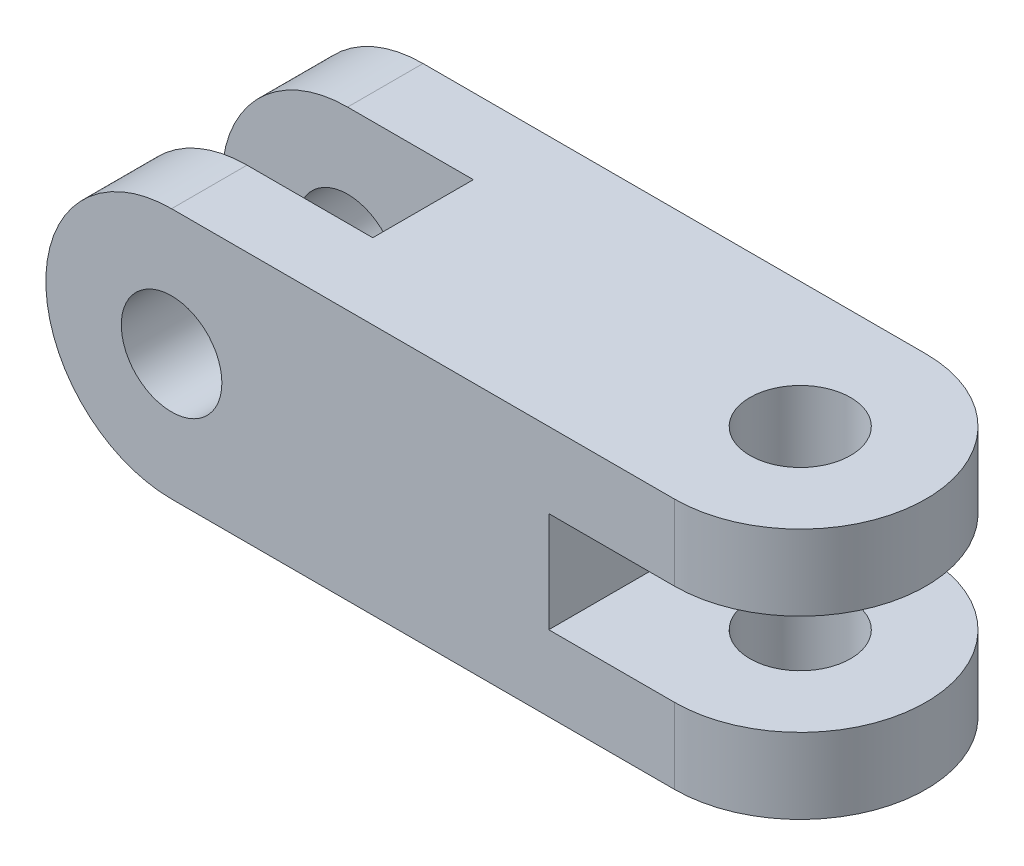
ISO-10303-21;
HEADER;
FILE_DESCRIPTION(('STEP AP214'),'2;1');
FILE_NAME('part.step','',(''),(''),'','','');
FILE_SCHEMA(('AUTOMOTIVE_DESIGN { 1 0 10303 214 1 1 1 1 }'));
ENDSEC;
DATA;
#1=APPLICATION_CONTEXT('core data for automotive mechanical design processes');
#2=APPLICATION_PROTOCOL_DEFINITION('international standard','automotive_design',2000,#1);
#3=PRODUCT_CONTEXT('',#1,'mechanical');
#4=PRODUCT('Part','Part','',(#3));
#5=PRODUCT_RELATED_PRODUCT_CATEGORY('part','',(#4));
#6=PRODUCT_DEFINITION_FORMATION('','',#4);
#7=PRODUCT_DEFINITION_CONTEXT('part definition',#1,'design');
#8=PRODUCT_DEFINITION('design','',#6,#7);
#9=PRODUCT_DEFINITION_SHAPE('','',#8);
#10=(LENGTH_UNIT() NAMED_UNIT(*) SI_UNIT(.MILLI.,.METRE.));
#11=(NAMED_UNIT(*) PLANE_ANGLE_UNIT() SI_UNIT($,.RADIAN.));
#12=(NAMED_UNIT(*) SI_UNIT($,.STERADIAN.) SOLID_ANGLE_UNIT());
#13=UNCERTAINTY_MEASURE_WITH_UNIT(LENGTH_MEASURE(1.E-05),#10,'distance_accuracy_value','');
#14=(GEOMETRIC_REPRESENTATION_CONTEXT(3) GLOBAL_UNCERTAINTY_ASSIGNED_CONTEXT((#13)) GLOBAL_UNIT_ASSIGNED_CONTEXT((#10,
#11,#12)) REPRESENTATION_CONTEXT('',''));
#15=CARTESIAN_POINT('',(0.,0.,0.));
#16=DIRECTION('',(0.,0.,1.));
#17=DIRECTION('',(1.,0.,0.));
#18=AXIS2_PLACEMENT_3D('',#15,#16,#17);
#19=CARTESIAN_POINT('',(-62.5,0.,-50.));
#20=DIRECTION('',(0.,0.,1.));
#21=DIRECTION('',(1.,0.,0.));
#22=AXIS2_PLACEMENT_3D('',#19,#20,#21);
#23=CYLINDRICAL_SURFACE('',#22,25.);
#24=CARTESIAN_POINT('',(-62.5,0.,-35.));
#25=DIRECTION('',(0.,0.,-1.));
#26=DIRECTION('',(-1.,0.,0.));
#27=AXIS2_PLACEMENT_3D('',#24,#25,#26);
#28=CIRCLE('',#27,25.);
#29=CARTESIAN_POINT('',(-62.5,25.,-35.));
#30=VERTEX_POINT('',#29);
#31=CARTESIAN_POINT('',(-62.5,-25.0000000000001,-35.));
#32=VERTEX_POINT('',#31);
#33=EDGE_CURVE('E175',#30,#32,#28,.F.);
#34=ORIENTED_EDGE('',*,*,#33,.F.);
#35=DIRECTION('',(0.,0.,1.));
#36=VECTOR('',#35,1.);
#37=CARTESIAN_POINT('',(-62.5,25.,-50.));
#38=LINE('',#37,#36);
#39=CARTESIAN_POINT('',(-62.5,25.,-50.));
#40=VERTEX_POINT('',#39);
#41=EDGE_CURVE('E268',#40,#30,#38,.T.);
#42=ORIENTED_EDGE('',*,*,#41,.F.);
#43=CARTESIAN_POINT('',(-62.5,0.,-50.));
#44=DIRECTION('',(0.,0.,1.));
#45=DIRECTION('',(1.,0.,0.));
#46=AXIS2_PLACEMENT_3D('',#43,#44,#45);
#47=CIRCLE('',#46,25.);
#48=CARTESIAN_POINT('',(-62.5,-25.,-50.));
#49=VERTEX_POINT('',#48);
#50=EDGE_CURVE('E232',#40,#49,#47,.T.);
#51=ORIENTED_EDGE('',*,*,#50,.T.);
#52=DIRECTION('',(0.,0.,1.));
#53=VECTOR('',#52,1.);
#54=CARTESIAN_POINT('',(-62.5,-25.,-50.));
#55=LINE('',#54,#53);
#56=EDGE_CURVE('E262',#49,#32,#55,.T.);
#57=ORIENTED_EDGE('',*,*,#56,.T.);
#58=EDGE_LOOP('',(#34,#42,#51,#57));
#59=FACE_BOUND('',#58,.T.);
#60=ADVANCED_FACE('F42',(#59),#23,.T.);
#61=CARTESIAN_POINT('',(-62.5,0.,-50.));
#62=DIRECTION('',(0.,0.,1.));
#63=DIRECTION('',(1.,0.,0.));
#64=AXIS2_PLACEMENT_3D('',#61,#62,#63);
#65=CYLINDRICAL_SURFACE('',#64,10.);
#66=CARTESIAN_POINT('',(-62.5,0.,-35.));
#67=DIRECTION('',(0.,0.,-1.));
#68=DIRECTION('',(-1.,0.,0.));
#69=AXIS2_PLACEMENT_3D('',#66,#67,#68);
#70=CIRCLE('',#69,10.);
#71=CARTESIAN_POINT('',(-72.5,0.,-35.));
#72=VERTEX_POINT('',#71);
#73=EDGE_CURVE('E46',#72,#72,#70,.F.);
#74=ORIENTED_EDGE('',*,*,#73,.T.);
#75=EDGE_LOOP('',(#74));
#76=FACE_BOUND('',#75,.T.);
#77=CARTESIAN_POINT('',(-62.5,0.,-50.));
#78=DIRECTION('',(0.,0.,1.));
#79=DIRECTION('',(1.,0.,0.));
#80=AXIS2_PLACEMENT_3D('',#77,#78,#79);
#81=CIRCLE('',#80,10.);
#82=CARTESIAN_POINT('',(-52.5,0.,-50.));
#83=VERTEX_POINT('',#82);
#84=EDGE_CURVE('E209',#83,#83,#81,.T.);
#85=ORIENTED_EDGE('',*,*,#84,.F.);
#86=EDGE_LOOP('',(#85));
#87=FACE_BOUND('',#86,.T.);
#88=ADVANCED_FACE('F303',(#76,#87),#65,.F.);
#89=CARTESIAN_POINT('',(-62.5,-25.,-50.));
#90=DIRECTION('',(0.,-1.,0.));
#91=DIRECTION('',(1.,0.,0.));
#92=AXIS2_PLACEMENT_3D('',#89,#90,#91);
#93=PLANE('',#92);
#94=DIRECTION('',(1.,0.,0.));
#95=VECTOR('',#94,1.);
#96=CARTESIAN_POINT('',(-62.5,-25.,-35.));
#97=LINE('',#96,#95);
#98=CARTESIAN_POINT('',(-37.5,-25.,-35.));
#99=VERTEX_POINT('',#98);
#100=EDGE_CURVE('E178',#32,#99,#97,.T.);
#101=ORIENTED_EDGE('',*,*,#100,.F.);
#102=ORIENTED_EDGE('',*,*,#56,.F.);
#103=DIRECTION('',(1.,0.,0.));
#104=VECTOR('',#103,1.);
#105=CARTESIAN_POINT('',(-62.5,-25.,-50.));
#106=LINE('',#105,#104);
#107=CARTESIAN_POINT('',(37.5,-25.,-50.));
#108=VERTEX_POINT('',#107);
#109=EDGE_CURVE('E236',#49,#108,#106,.T.);
#110=ORIENTED_EDGE('',*,*,#109,.T.);
#111=CARTESIAN_POINT('',(37.5,-25.,-25.));
#112=DIRECTION('',(0.,-1.,0.));
#113=DIRECTION('',(1.,0.,0.));
#114=AXIS2_PLACEMENT_3D('',#111,#112,#113);
#115=CIRCLE('',#114,25.);
#116=CARTESIAN_POINT('',(37.5,-25.,0.));
#117=VERTEX_POINT('',#116);
#118=EDGE_CURVE('E67',#108,#117,#115,.T.);
#119=ORIENTED_EDGE('',*,*,#118,.T.);
#120=DIRECTION('',(1.,0.,0.));
#121=VECTOR('',#120,1.);
#122=CARTESIAN_POINT('',(-62.5,-25.,0.));
#123=LINE('',#122,#121);
#124=CARTESIAN_POINT('',(-62.5,-25.,0.));
#125=VERTEX_POINT('',#124);
#126=EDGE_CURVE('E221',#125,#117,#123,.T.);
#127=ORIENTED_EDGE('',*,*,#126,.F.);
#128=CARTESIAN_POINT('',(-62.5,-25.0000000000001,-15.));
#129=VERTEX_POINT('',#128);
#130=EDGE_CURVE('E267',#129,#125,#55,.T.);
#131=ORIENTED_EDGE('',*,*,#130,.F.);
#132=DIRECTION('',(-1.,0.,0.));
#133=VECTOR('',#132,1.);
#134=CARTESIAN_POINT('',(-62.5,-25.,-15.));
#135=LINE('',#134,#133);
#136=CARTESIAN_POINT('',(-37.5,-25.,-15.));
#137=VERTEX_POINT('',#136);
#138=EDGE_CURVE('E172',#137,#129,#135,.T.);
#139=ORIENTED_EDGE('',*,*,#138,.F.);
#140=DIRECTION('',(0.,0.,1.));
#141=VECTOR('',#140,1.);
#142=CARTESIAN_POINT('',(-37.5,-25.,-50.));
#143=LINE('',#142,#141);
#144=EDGE_CURVE('E141',#99,#137,#143,.T.);
#145=ORIENTED_EDGE('',*,*,#144,.F.);
#146=EDGE_LOOP('',(#101,#102,#110,#119,#127,#131,#139,#145));
#147=FACE_BOUND('',#146,.T.);
#148=CARTESIAN_POINT('',(37.5,-25.,-25.));
#149=DIRECTION('',(0.,-1.,0.));
#150=DIRECTION('',(1.,0.,0.));
#151=AXIS2_PLACEMENT_3D('',#148,#149,#150);
#152=CIRCLE('',#151,10.);
#153=CARTESIAN_POINT('',(47.5,-25.,-25.));
#154=VERTEX_POINT('',#153);
#155=EDGE_CURVE('E192',#154,#154,#152,.T.);
#156=ORIENTED_EDGE('',*,*,#155,.F.);
#157=EDGE_LOOP('',(#156));
#158=FACE_BOUND('',#157,.T.);
#159=ADVANCED_FACE('F310',(#147,#158),#93,.T.);
#160=CARTESIAN_POINT('',(-62.5,25.,-50.));
#161=DIRECTION('',(0.,1.,0.));
#162=DIRECTION('',(-1.,0.,0.));
#163=AXIS2_PLACEMENT_3D('',#160,#161,#162);
#164=PLANE('',#163);
#165=DIRECTION('',(-1.,0.,0.));
#166=VECTOR('',#165,1.);
#167=CARTESIAN_POINT('',(-37.5,25.,-35.));
#168=LINE('',#167,#166);
#169=CARTESIAN_POINT('',(-37.5,25.,-35.));
#170=VERTEX_POINT('',#169);
#171=EDGE_CURVE('E146',#170,#30,#168,.T.);
#172=ORIENTED_EDGE('',*,*,#171,.F.);
#173=DIRECTION('',(0.,0.,-1.));
#174=VECTOR('',#173,1.);
#175=CARTESIAN_POINT('',(-37.5,25.,-15.));
#176=LINE('',#175,#174);
#177=CARTESIAN_POINT('',(-37.5,25.,-15.));
#178=VERTEX_POINT('',#177);
#179=EDGE_CURVE('E138',#178,#170,#176,.T.);
#180=ORIENTED_EDGE('',*,*,#179,.F.);
#181=DIRECTION('',(1.,0.,0.));
#182=VECTOR('',#181,1.);
#183=CARTESIAN_POINT('',(-37.5,25.,-15.));
#184=LINE('',#183,#182);
#185=CARTESIAN_POINT('',(-62.5,25.,-15.));
#186=VERTEX_POINT('',#185);
#187=EDGE_CURVE('E149',#186,#178,#184,.T.);
#188=ORIENTED_EDGE('',*,*,#187,.F.);
#189=CARTESIAN_POINT('',(-62.5,25.,0.));
#190=VERTEX_POINT('',#189);
#191=EDGE_CURVE('E271',#186,#190,#38,.T.);
#192=ORIENTED_EDGE('',*,*,#191,.T.);
#193=DIRECTION('',(-1.,0.,0.));
#194=VECTOR('',#193,1.);
#195=CARTESIAN_POINT('',(-62.5,25.,0.));
#196=LINE('',#195,#194);
#197=CARTESIAN_POINT('',(37.5,25.,0.));
#198=VERTEX_POINT('',#197);
#199=EDGE_CURVE('E251',#198,#190,#196,.T.);
#200=ORIENTED_EDGE('',*,*,#199,.F.);
#201=CARTESIAN_POINT('',(37.5,25.,-25.));
#202=DIRECTION('',(0.,1.,0.));
#203=DIRECTION('',(-1.,0.,0.));
#204=AXIS2_PLACEMENT_3D('',#201,#202,#203);
#205=CIRCLE('',#204,25.);
#206=CARTESIAN_POINT('',(37.5,25.,-50.));
#207=VERTEX_POINT('',#206);
#208=EDGE_CURVE('E196',#198,#207,#205,.T.);
#209=ORIENTED_EDGE('',*,*,#208,.T.);
#210=DIRECTION('',(-1.,0.,0.));
#211=VECTOR('',#210,1.);
#212=CARTESIAN_POINT('',(-62.5,25.,-50.));
#213=LINE('',#212,#211);
#214=EDGE_CURVE('E229',#207,#40,#213,.T.);
#215=ORIENTED_EDGE('',*,*,#214,.T.);
#216=ORIENTED_EDGE('',*,*,#41,.T.);
#217=EDGE_LOOP('',(#172,#180,#188,#192,#200,#209,#215,#216));
#218=FACE_BOUND('',#217,.T.);
#219=CARTESIAN_POINT('',(37.5,25.,-25.));
#220=DIRECTION('',(0.,1.,0.));
#221=DIRECTION('',(-1.,0.,0.));
#222=AXIS2_PLACEMENT_3D('',#219,#220,#221);
#223=CIRCLE('',#222,10.);
#224=CARTESIAN_POINT('',(27.5,25.,-25.));
#225=VERTEX_POINT('',#224);
#226=EDGE_CURVE('E183',#225,#225,#223,.T.);
#227=ORIENTED_EDGE('',*,*,#226,.F.);
#228=EDGE_LOOP('',(#227));
#229=FACE_BOUND('',#228,.T.);
#230=ADVANCED_FACE('F158',(#218,#229),#164,.T.);
#231=CARTESIAN_POINT('',(12.5,9.99999999999998,-50.));
#232=DIRECTION('',(0.,-1.,0.));
#233=DIRECTION('',(0.,0.,-1.));
#234=AXIS2_PLACEMENT_3D('',#231,#232,#233);
#235=PLANE('',#234);
#236=CARTESIAN_POINT('',(37.5,9.99999999999998,-25.));
#237=DIRECTION('',(0.,-1.,0.));
#238=DIRECTION('',(0.,0.,-1.));
#239=AXIS2_PLACEMENT_3D('',#236,#237,#238);
#240=CIRCLE('',#239,10.);
#241=CARTESIAN_POINT('',(37.5,9.99999999999998,-35.));
#242=VERTEX_POINT('',#241);
#243=EDGE_CURVE('E188',#242,#242,#240,.T.);
#244=ORIENTED_EDGE('',*,*,#243,.F.);
#245=EDGE_LOOP('',(#244));
#246=FACE_BOUND('',#245,.T.);
#247=CARTESIAN_POINT('',(37.5,9.99999999999998,-25.));
#248=DIRECTION('',(0.,-1.,0.));
#249=DIRECTION('',(0.,0.,-1.));
#250=AXIS2_PLACEMENT_3D('',#247,#248,#249);
#251=CIRCLE('',#250,25.);
#252=CARTESIAN_POINT('',(37.5,9.99999999999998,-50.));
#253=VERTEX_POINT('',#252);
#254=CARTESIAN_POINT('',(37.5,9.99999999999998,0.));
#255=VERTEX_POINT('',#254);
#256=EDGE_CURVE('E59',#253,#255,#251,.T.);
#257=ORIENTED_EDGE('',*,*,#256,.T.);
#258=DIRECTION('',(1.,0.,0.));
#259=VECTOR('',#258,1.);
#260=CARTESIAN_POINT('',(12.5,9.99999999999998,0.));
#261=LINE('',#260,#259);
#262=CARTESIAN_POINT('',(12.5,9.99999999999998,0.));
#263=VERTEX_POINT('',#262);
#264=EDGE_CURVE('E247',#263,#255,#261,.T.);
#265=ORIENTED_EDGE('',*,*,#264,.F.);
#266=DIRECTION('',(0.,0.,1.));
#267=VECTOR('',#266,1.);
#268=CARTESIAN_POINT('',(12.5,9.99999999999998,-50.));
#269=LINE('',#268,#267);
#270=CARTESIAN_POINT('',(12.5,9.99999999999998,-50.));
#271=VERTEX_POINT('',#270);
#272=EDGE_CURVE('E272',#271,#263,#269,.T.);
#273=ORIENTED_EDGE('',*,*,#272,.F.);
#274=DIRECTION('',(1.,0.,0.));
#275=VECTOR('',#274,1.);
#276=CARTESIAN_POINT('',(12.5,9.99999999999998,-50.));
#277=LINE('',#276,#275);
#278=EDGE_CURVE('E225',#271,#253,#277,.T.);
#279=ORIENTED_EDGE('',*,*,#278,.T.);
#280=EDGE_LOOP('',(#257,#265,#273,#279));
#281=FACE_BOUND('',#280,.T.);
#282=ADVANCED_FACE('F358',(#246,#281),#235,.T.);
#283=CARTESIAN_POINT('',(12.5,-10.,-50.));
#284=DIRECTION('',(0.,1.,0.));
#285=DIRECTION('',(0.,0.,1.));
#286=AXIS2_PLACEMENT_3D('',#283,#284,#285);
#287=PLANE('',#286);
#288=CARTESIAN_POINT('',(37.5,-10.,-25.));
#289=DIRECTION('',(0.,1.,0.));
#290=DIRECTION('',(0.,0.,1.));
#291=AXIS2_PLACEMENT_3D('',#288,#289,#290);
#292=CIRCLE('',#291,10.);
#293=CARTESIAN_POINT('',(37.5,-10.,-15.));
#294=VERTEX_POINT('',#293);
#295=EDGE_CURVE('E187',#294,#294,#292,.T.);
#296=ORIENTED_EDGE('',*,*,#295,.F.);
#297=EDGE_LOOP('',(#296));
#298=FACE_BOUND('',#297,.T.);
#299=DIRECTION('',(-1.,0.,0.));
#300=VECTOR('',#299,1.);
#301=CARTESIAN_POINT('',(12.5,-10.,0.));
#302=LINE('',#301,#300);
#303=CARTESIAN_POINT('',(37.5,-10.,0.));
#304=VERTEX_POINT('',#303);
#305=CARTESIAN_POINT('',(12.5,-10.,0.));
#306=VERTEX_POINT('',#305);
#307=EDGE_CURVE('E213',#304,#306,#302,.T.);
#308=ORIENTED_EDGE('',*,*,#307,.F.);
#309=CARTESIAN_POINT('',(37.5,-10.,-25.));
#310=DIRECTION('',(0.,1.,0.));
#311=DIRECTION('',(0.,0.,1.));
#312=AXIS2_PLACEMENT_3D('',#309,#310,#311);
#313=CIRCLE('',#312,25.);
#314=CARTESIAN_POINT('',(37.5,-10.,-50.));
#315=VERTEX_POINT('',#314);
#316=EDGE_CURVE('E200',#304,#315,#313,.T.);
#317=ORIENTED_EDGE('',*,*,#316,.T.);
#318=DIRECTION('',(-1.,0.,0.));
#319=VECTOR('',#318,1.);
#320=CARTESIAN_POINT('',(12.5,-10.,-50.));
#321=LINE('',#320,#319);
#322=CARTESIAN_POINT('',(12.5,-10.,-50.));
#323=VERTEX_POINT('',#322);
#324=EDGE_CURVE('E217',#315,#323,#321,.T.);
#325=ORIENTED_EDGE('',*,*,#324,.T.);
#326=DIRECTION('',(0.,0.,1.));
#327=VECTOR('',#326,1.);
#328=CARTESIAN_POINT('',(12.5,-10.,-50.));
#329=LINE('',#328,#327);
#330=EDGE_CURVE('E240',#323,#306,#329,.T.);
#331=ORIENTED_EDGE('',*,*,#330,.T.);
#332=EDGE_LOOP('',(#308,#317,#325,#331));
#333=FACE_BOUND('',#332,.T.);
#334=ADVANCED_FACE('F44',(#298,#333),#287,.T.);
#335=CARTESIAN_POINT('',(-62.5,0.,-50.));
#336=DIRECTION('',(0.,0.,1.));
#337=DIRECTION('',(1.,0.,0.));
#338=AXIS2_PLACEMENT_3D('',#335,#336,#337);
#339=PLANE('',#338);
#340=ORIENTED_EDGE('',*,*,#84,.T.);
#341=EDGE_LOOP('',(#340));
#342=FACE_BOUND('',#341,.T.);
#343=DIRECTION('',(0.,1.,0.));
#344=VECTOR('',#343,1.);
#345=CARTESIAN_POINT('',(37.5,-61.,-50.));
#346=LINE('',#345,#344);
#347=EDGE_CURVE('E279',#108,#315,#346,.T.);
#348=ORIENTED_EDGE('',*,*,#347,.F.);
#349=ORIENTED_EDGE('',*,*,#109,.F.);
#350=ORIENTED_EDGE('',*,*,#50,.F.);
#351=ORIENTED_EDGE('',*,*,#214,.F.);
#352=EDGE_CURVE('E266',#253,#207,#346,.T.);
#353=ORIENTED_EDGE('',*,*,#352,.F.);
#354=ORIENTED_EDGE('',*,*,#278,.F.);
#355=DIRECTION('',(0.,1.,0.));
#356=VECTOR('',#355,1.);
#357=CARTESIAN_POINT('',(12.5,9.99999999999998,-50.));
#358=LINE('',#357,#356);
#359=EDGE_CURVE('E220',#323,#271,#358,.T.);
#360=ORIENTED_EDGE('',*,*,#359,.F.);
#361=ORIENTED_EDGE('',*,*,#324,.F.);
#362=EDGE_LOOP('',(#348,#349,#350,#351,#353,#354,#360,#361));
#363=FACE_BOUND('',#362,.T.);
#364=ADVANCED_FACE('F317',(#342,#363),#339,.F.);
#365=CARTESIAN_POINT('',(-62.5,0.,-15.));
#366=DIRECTION('',(0.,0.,1.));
#367=DIRECTION('',(1.,0.,0.));
#368=AXIS2_PLACEMENT_3D('',#365,#366,#367);
#369=CIRCLE('',#368,25.);
#370=EDGE_CURVE('E153',#129,#186,#369,.F.);
#371=ORIENTED_EDGE('',*,*,#370,.F.);
#372=ORIENTED_EDGE('',*,*,#130,.T.);
#373=CARTESIAN_POINT('',(-62.5,0.,0.));
#374=DIRECTION('',(0.,0.,1.));
#375=DIRECTION('',(1.,0.,0.));
#376=AXIS2_PLACEMENT_3D('',#373,#374,#375);
#377=CIRCLE('',#376,25.);
#378=EDGE_CURVE('E255',#190,#125,#377,.T.);
#379=ORIENTED_EDGE('',*,*,#378,.F.);
#380=ORIENTED_EDGE('',*,*,#191,.F.);
#381=EDGE_LOOP('',(#371,#372,#379,#380));
#382=FACE_BOUND('',#381,.T.);
#383=ADVANCED_FACE('F306',(#382),#23,.T.);
#384=CARTESIAN_POINT('',(12.5,9.99999999999998,-50.));
#385=DIRECTION('',(1.,0.,0.));
#386=DIRECTION('',(0.,1.,0.));
#387=AXIS2_PLACEMENT_3D('',#384,#385,#386);
#388=PLANE('',#387);
#389=DIRECTION('',(0.,1.,0.));
#390=VECTOR('',#389,1.);
#391=CARTESIAN_POINT('',(12.5,9.99999999999998,0.));
#392=LINE('',#391,#390);
#393=EDGE_CURVE('E243',#306,#263,#392,.T.);
#394=ORIENTED_EDGE('',*,*,#393,.F.);
#395=ORIENTED_EDGE('',*,*,#330,.F.);
#396=ORIENTED_EDGE('',*,*,#359,.T.);
#397=ORIENTED_EDGE('',*,*,#272,.T.);
#398=EDGE_LOOP('',(#394,#395,#396,#397));
#399=FACE_BOUND('',#398,.T.);
#400=ADVANCED_FACE('F316',(#399),#388,.T.);
#401=CARTESIAN_POINT('',(-62.5,0.,0.));
#402=DIRECTION('',(0.,0.,1.));
#403=DIRECTION('',(1.,0.,0.));
#404=AXIS2_PLACEMENT_3D('',#401,#402,#403);
#405=PLANE('',#404);
#406=DIRECTION('',(0.,1.,0.));
#407=VECTOR('',#406,1.);
#408=CARTESIAN_POINT('',(37.5,-61.,0.));
#409=LINE('',#408,#407);
#410=EDGE_CURVE('E11',#198,#255,#409,.F.);
#411=ORIENTED_EDGE('',*,*,#410,.F.);
#412=ORIENTED_EDGE('',*,*,#199,.T.);
#413=ORIENTED_EDGE('',*,*,#378,.T.);
#414=ORIENTED_EDGE('',*,*,#126,.T.);
#415=EDGE_CURVE('E52',#304,#117,#409,.F.);
#416=ORIENTED_EDGE('',*,*,#415,.F.);
#417=ORIENTED_EDGE('',*,*,#307,.T.);
#418=ORIENTED_EDGE('',*,*,#393,.T.);
#419=ORIENTED_EDGE('',*,*,#264,.T.);
#420=EDGE_LOOP('',(#411,#412,#413,#414,#416,#417,#418,#419));
#421=FACE_BOUND('',#420,.T.);
#422=CARTESIAN_POINT('',(-62.5,0.,0.));
#423=DIRECTION('',(0.,0.,1.));
#424=DIRECTION('',(1.,0.,0.));
#425=AXIS2_PLACEMENT_3D('',#422,#423,#424);
#426=CIRCLE('',#425,10.);
#427=CARTESIAN_POINT('',(-52.5,0.,0.));
#428=VERTEX_POINT('',#427);
#429=EDGE_CURVE('E208',#428,#428,#426,.T.);
#430=ORIENTED_EDGE('',*,*,#429,.F.);
#431=EDGE_LOOP('',(#430));
#432=FACE_BOUND('',#431,.T.);
#433=ADVANCED_FACE('F323',(#421,#432),#405,.T.);
#434=CARTESIAN_POINT('',(-62.5,0.,-15.));
#435=DIRECTION('',(0.,0.,1.));
#436=DIRECTION('',(1.,0.,0.));
#437=AXIS2_PLACEMENT_3D('',#434,#435,#436);
#438=CIRCLE('',#437,10.);
#439=CARTESIAN_POINT('',(-52.5,0.,-15.));
#440=VERTEX_POINT('',#439);
#441=EDGE_CURVE('E168',#440,#440,#438,.F.);
#442=ORIENTED_EDGE('',*,*,#441,.T.);
#443=EDGE_LOOP('',(#442));
#444=FACE_BOUND('',#443,.T.);
#445=ORIENTED_EDGE('',*,*,#429,.T.);
#446=EDGE_LOOP('',(#445));
#447=FACE_BOUND('',#446,.T.);
#448=ADVANCED_FACE('F288',(#444,#447),#65,.F.);
#449=CARTESIAN_POINT('',(37.5,-61.,-25.));
#450=DIRECTION('',(0.,1.,0.));
#451=DIRECTION('',(-1.,0.,0.));
#452=AXIS2_PLACEMENT_3D('',#449,#450,#451);
#453=CYLINDRICAL_SURFACE('',#452,25.);
#454=ORIENTED_EDGE('',*,*,#352,.T.);
#455=ORIENTED_EDGE('',*,*,#208,.F.);
#456=ORIENTED_EDGE('',*,*,#410,.T.);
#457=ORIENTED_EDGE('',*,*,#256,.F.);
#458=EDGE_LOOP('',(#454,#455,#456,#457));
#459=FACE_BOUND('',#458,.T.);
#460=ADVANCED_FACE('F352',(#459),#453,.T.);
#461=ORIENTED_EDGE('',*,*,#347,.T.);
#462=ORIENTED_EDGE('',*,*,#316,.F.);
#463=ORIENTED_EDGE('',*,*,#415,.T.);
#464=ORIENTED_EDGE('',*,*,#118,.F.);
#465=EDGE_LOOP('',(#461,#462,#463,#464));
#466=FACE_BOUND('',#465,.T.);
#467=ADVANCED_FACE('F363',(#466),#453,.T.);
#468=CARTESIAN_POINT('',(37.5,-61.,-25.));
#469=DIRECTION('',(0.,1.,0.));
#470=DIRECTION('',(-1.,0.,0.));
#471=AXIS2_PLACEMENT_3D('',#468,#469,#470);
#472=CYLINDRICAL_SURFACE('',#471,10.);
#473=ORIENTED_EDGE('',*,*,#155,.T.);
#474=EDGE_LOOP('',(#473));
#475=FACE_BOUND('',#474,.T.);
#476=ORIENTED_EDGE('',*,*,#295,.T.);
#477=EDGE_LOOP('',(#476));
#478=FACE_BOUND('',#477,.T.);
#479=ADVANCED_FACE('F365',(#475,#478),#472,.F.);
#480=ORIENTED_EDGE('',*,*,#243,.T.);
#481=EDGE_LOOP('',(#480));
#482=FACE_BOUND('',#481,.T.);
#483=ORIENTED_EDGE('',*,*,#226,.T.);
#484=EDGE_LOOP('',(#483));
#485=FACE_BOUND('',#484,.T.);
#486=ADVANCED_FACE('F298',(#482,#485),#472,.F.);
#487=CARTESIAN_POINT('',(-37.5,-61.,-35.));
#488=DIRECTION('',(0.,0.,-1.));
#489=DIRECTION('',(-1.,0.,0.));
#490=AXIS2_PLACEMENT_3D('',#487,#488,#489);
#491=PLANE('',#490);
#492=ORIENTED_EDGE('',*,*,#100,.T.);
#493=DIRECTION('',(0.,1.,0.));
#494=VECTOR('',#493,1.);
#495=CARTESIAN_POINT('',(-37.5,-61.,-35.));
#496=LINE('',#495,#494);
#497=EDGE_CURVE('E145',#99,#170,#496,.T.);
#498=ORIENTED_EDGE('',*,*,#497,.T.);
#499=ORIENTED_EDGE('',*,*,#171,.T.);
#500=ORIENTED_EDGE('',*,*,#33,.T.);
#501=EDGE_LOOP('',(#492,#498,#499,#500));
#502=FACE_BOUND('',#501,.T.);
#503=ORIENTED_EDGE('',*,*,#73,.F.);
#504=EDGE_LOOP('',(#503));
#505=FACE_BOUND('',#504,.T.);
#506=ADVANCED_FACE('F291',(#502,#505),#491,.F.);
#507=CARTESIAN_POINT('',(-37.5,-61.,-15.));
#508=DIRECTION('',(0.,0.,1.));
#509=DIRECTION('',(1.,0.,0.));
#510=AXIS2_PLACEMENT_3D('',#507,#508,#509);
#511=PLANE('',#510);
#512=ORIENTED_EDGE('',*,*,#138,.T.);
#513=ORIENTED_EDGE('',*,*,#370,.T.);
#514=ORIENTED_EDGE('',*,*,#187,.T.);
#515=DIRECTION('',(0.,1.,0.));
#516=VECTOR('',#515,1.);
#517=CARTESIAN_POINT('',(-37.5,-61.,-15.));
#518=LINE('',#517,#516);
#519=EDGE_CURVE('E133',#137,#178,#518,.T.);
#520=ORIENTED_EDGE('',*,*,#519,.F.);
#521=EDGE_LOOP('',(#512,#513,#514,#520));
#522=FACE_BOUND('',#521,.T.);
#523=ORIENTED_EDGE('',*,*,#441,.F.);
#524=EDGE_LOOP('',(#523));
#525=FACE_BOUND('',#524,.T.);
#526=ADVANCED_FACE('F150',(#522,#525),#511,.F.);
#527=CARTESIAN_POINT('',(-37.5,-61.,-15.));
#528=DIRECTION('',(1.,0.,0.));
#529=DIRECTION('',(0.,1.,0.));
#530=AXIS2_PLACEMENT_3D('',#527,#528,#529);
#531=PLANE('',#530);
#532=ORIENTED_EDGE('',*,*,#144,.T.);
#533=ORIENTED_EDGE('',*,*,#519,.T.);
#534=ORIENTED_EDGE('',*,*,#179,.T.);
#535=ORIENTED_EDGE('',*,*,#497,.F.);
#536=EDGE_LOOP('',(#532,#533,#534,#535));
#537=FACE_BOUND('',#536,.T.);
#538=ADVANCED_FACE('F135',(#537),#531,.F.);
#539=CLOSED_SHELL('',(#60,#88,#159,#230,#282,#334,#364,#383,#400,#433,#448,#460,#467,#479,#486,
#506,#526,#538));
#540=MANIFOLD_SOLID_BREP('B2',#539);
#541=ADVANCED_BREP_SHAPE_REPRESENTATION('',(#18,#540),#14);
#542=SHAPE_DEFINITION_REPRESENTATION(#9,#541);
ENDSEC;
END-ISO-10303-21;
